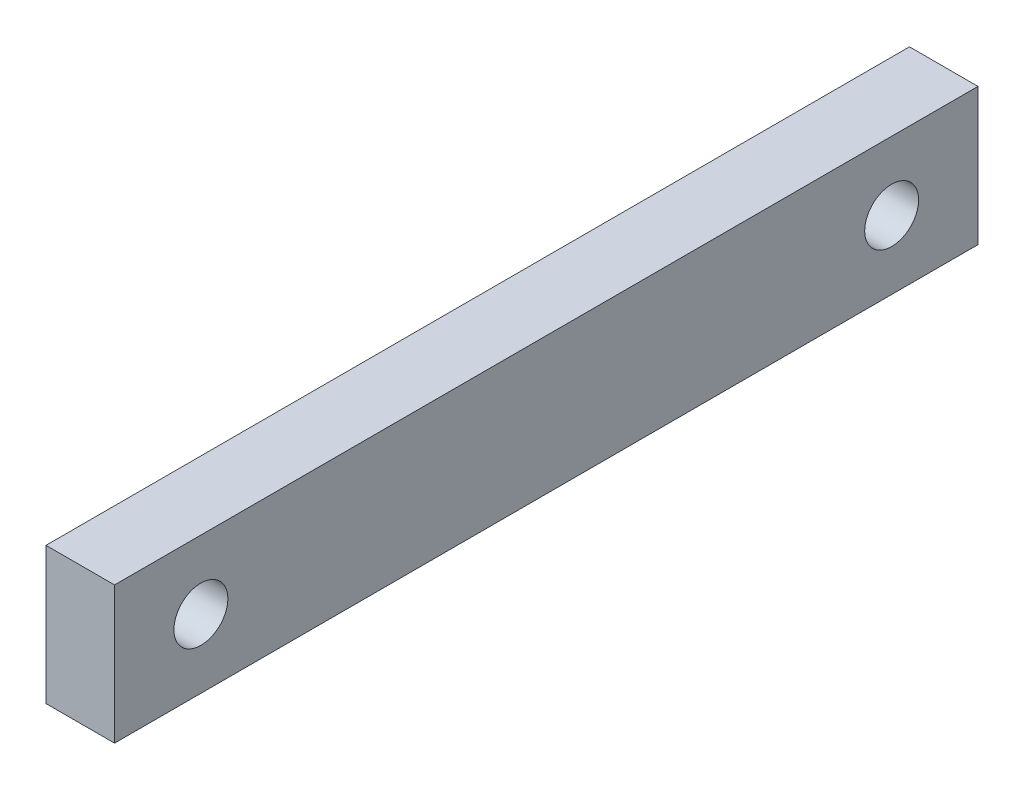
ISO-10303-21;
HEADER;
FILE_DESCRIPTION(('STEP AP214'),'2;1');
FILE_NAME('part.step','',(''),(''),'','','');
FILE_SCHEMA(('AUTOMOTIVE_DESIGN { 1 0 10303 214 1 1 1 1 }'));
ENDSEC;
DATA;
#1=APPLICATION_CONTEXT('core data for automotive mechanical design processes');
#2=APPLICATION_PROTOCOL_DEFINITION('international standard','automotive_design',2000,#1);
#3=PRODUCT_CONTEXT('',#1,'mechanical');
#4=PRODUCT('Part','Part','',(#3));
#5=PRODUCT_RELATED_PRODUCT_CATEGORY('part','',(#4));
#6=PRODUCT_DEFINITION_FORMATION('','',#4);
#7=PRODUCT_DEFINITION_CONTEXT('part definition',#1,'design');
#8=PRODUCT_DEFINITION('design','',#6,#7);
#9=PRODUCT_DEFINITION_SHAPE('','',#8);
#10=(LENGTH_UNIT() NAMED_UNIT(*) SI_UNIT(.MILLI.,.METRE.));
#11=(NAMED_UNIT(*) PLANE_ANGLE_UNIT() SI_UNIT($,.RADIAN.));
#12=(NAMED_UNIT(*) SI_UNIT($,.STERADIAN.) SOLID_ANGLE_UNIT());
#13=UNCERTAINTY_MEASURE_WITH_UNIT(LENGTH_MEASURE(1.E-05),#10,'distance_accuracy_value','');
#14=(GEOMETRIC_REPRESENTATION_CONTEXT(3) GLOBAL_UNCERTAINTY_ASSIGNED_CONTEXT((#13)) GLOBAL_UNIT_ASSIGNED_CONTEXT((#10,
#11,#12)) REPRESENTATION_CONTEXT('',''));
#15=CARTESIAN_POINT('',(0.,0.,0.));
#16=DIRECTION('',(0.,0.,1.));
#17=DIRECTION('',(1.,0.,0.));
#18=AXIS2_PLACEMENT_3D('',#15,#16,#17);
#19=CARTESIAN_POINT('',(3.175,-6.35,-40.));
#20=DIRECTION('',(1.,0.,0.));
#21=DIRECTION('',(0.,0.,-1.));
#22=AXIS2_PLACEMENT_3D('',#19,#20,#21);
#23=PLANE('',#22);
#24=CARTESIAN_POINT('',(3.175,0.,32.));
#25=DIRECTION('',(1.,0.,0.));
#26=DIRECTION('',(0.,0.,-1.));
#27=AXIS2_PLACEMENT_3D('',#24,#25,#26);
#28=CIRCLE('',#27,2.49999999999999);
#29=CARTESIAN_POINT('',(3.175,0.,29.5));
#30=VERTEX_POINT('',#29);
#31=EDGE_CURVE('E105',#30,#30,#28,.T.);
#32=ORIENTED_EDGE('',*,*,#31,.F.);
#33=EDGE_LOOP('',(#32));
#34=FACE_BOUND('',#33,.T.);
#35=CARTESIAN_POINT('',(3.175,0.,-32.));
#36=DIRECTION('',(1.,0.,0.));
#37=DIRECTION('',(0.,0.,1.));
#38=AXIS2_PLACEMENT_3D('',#35,#36,#37);
#39=CIRCLE('',#38,2.49999999999999);
#40=CARTESIAN_POINT('',(3.175,0.,-29.5));
#41=VERTEX_POINT('',#40);
#42=EDGE_CURVE('E108',#41,#41,#39,.T.);
#43=ORIENTED_EDGE('',*,*,#42,.F.);
#44=EDGE_LOOP('',(#43));
#45=FACE_BOUND('',#44,.T.);
#46=DIRECTION('',(0.,0.,1.));
#47=VECTOR('',#46,1.);
#48=CARTESIAN_POINT('',(3.175,6.35,-40.));
#49=LINE('',#48,#47);
#50=CARTESIAN_POINT('',(3.175,6.35,-40.));
#51=VERTEX_POINT('',#50);
#52=CARTESIAN_POINT('',(3.175,6.35,40.));
#53=VERTEX_POINT('',#52);
#54=EDGE_CURVE('E42',#51,#53,#49,.T.);
#55=ORIENTED_EDGE('',*,*,#54,.T.);
#56=DIRECTION('',(0.,1.,0.));
#57=VECTOR('',#56,1.);
#58=CARTESIAN_POINT('',(3.175,-6.35,40.));
#59=LINE('',#58,#57);
#60=CARTESIAN_POINT('',(3.175,-6.35,40.));
#61=VERTEX_POINT('',#60);
#62=EDGE_CURVE('E80',#61,#53,#59,.T.);
#63=ORIENTED_EDGE('',*,*,#62,.F.);
#64=DIRECTION('',(0.,0.,1.));
#65=VECTOR('',#64,1.);
#66=CARTESIAN_POINT('',(3.175,-6.35,-40.));
#67=LINE('',#66,#65);
#68=CARTESIAN_POINT('',(3.175,-6.35,-40.));
#69=VERTEX_POINT('',#68);
#70=EDGE_CURVE('E11',#69,#61,#67,.T.);
#71=ORIENTED_EDGE('',*,*,#70,.F.);
#72=DIRECTION('',(0.,1.,0.));
#73=VECTOR('',#72,1.);
#74=CARTESIAN_POINT('',(3.175,-6.35,-40.));
#75=LINE('',#74,#73);
#76=EDGE_CURVE('E81',#69,#51,#75,.T.);
#77=ORIENTED_EDGE('',*,*,#76,.T.);
#78=EDGE_LOOP('',(#55,#63,#71,#77));
#79=FACE_BOUND('',#78,.T.);
#80=ADVANCED_FACE('F39',(#34,#45,#79),#23,.T.);
#81=CARTESIAN_POINT('',(-3.175,-6.35,-40.));
#82=DIRECTION('',(0.,-1.,0.));
#83=DIRECTION('',(0.,0.,-1.));
#84=AXIS2_PLACEMENT_3D('',#81,#82,#83);
#85=PLANE('',#84);
#86=ORIENTED_EDGE('',*,*,#70,.T.);
#87=DIRECTION('',(1.,0.,0.));
#88=VECTOR('',#87,1.);
#89=CARTESIAN_POINT('',(-3.175,-6.35,40.));
#90=LINE('',#89,#88);
#91=CARTESIAN_POINT('',(-3.175,-6.35,40.));
#92=VERTEX_POINT('',#91);
#93=EDGE_CURVE('E99',#92,#61,#90,.T.);
#94=ORIENTED_EDGE('',*,*,#93,.F.);
#95=DIRECTION('',(0.,0.,1.));
#96=VECTOR('',#95,1.);
#97=CARTESIAN_POINT('',(-3.175,-6.35,-40.));
#98=LINE('',#97,#96);
#99=CARTESIAN_POINT('',(-3.175,-6.35,-40.));
#100=VERTEX_POINT('',#99);
#101=EDGE_CURVE('E48',#100,#92,#98,.T.);
#102=ORIENTED_EDGE('',*,*,#101,.F.);
#103=DIRECTION('',(1.,0.,0.));
#104=VECTOR('',#103,1.);
#105=CARTESIAN_POINT('',(-3.175,-6.35,-40.));
#106=LINE('',#105,#104);
#107=EDGE_CURVE('E87',#100,#69,#106,.T.);
#108=ORIENTED_EDGE('',*,*,#107,.T.);
#109=EDGE_LOOP('',(#86,#94,#102,#108));
#110=FACE_BOUND('',#109,.T.);
#111=ADVANCED_FACE('F131',(#110),#85,.T.);
#112=CARTESIAN_POINT('',(-3.175,-6.35,-40.));
#113=DIRECTION('',(-1.,0.,0.));
#114=DIRECTION('',(0.,0.,1.));
#115=AXIS2_PLACEMENT_3D('',#112,#113,#114);
#116=PLANE('',#115);
#117=CARTESIAN_POINT('',(-3.175,0.,32.));
#118=DIRECTION('',(1.,0.,0.));
#119=DIRECTION('',(0.,0.,-1.));
#120=AXIS2_PLACEMENT_3D('',#117,#118,#119);
#121=CIRCLE('',#120,2.49999999999999);
#122=CARTESIAN_POINT('',(-3.175,0.,29.5));
#123=VERTEX_POINT('',#122);
#124=EDGE_CURVE('E101',#123,#123,#121,.T.);
#125=ORIENTED_EDGE('',*,*,#124,.T.);
#126=EDGE_LOOP('',(#125));
#127=FACE_BOUND('',#126,.T.);
#128=CARTESIAN_POINT('',(-3.175,0.,-32.));
#129=DIRECTION('',(1.,0.,0.));
#130=DIRECTION('',(0.,0.,1.));
#131=AXIS2_PLACEMENT_3D('',#128,#129,#130);
#132=CIRCLE('',#131,2.49999999999999);
#133=CARTESIAN_POINT('',(-3.175,0.,-29.5));
#134=VERTEX_POINT('',#133);
#135=EDGE_CURVE('E155',#134,#134,#132,.T.);
#136=ORIENTED_EDGE('',*,*,#135,.T.);
#137=EDGE_LOOP('',(#136));
#138=FACE_BOUND('',#137,.T.);
#139=ORIENTED_EDGE('',*,*,#101,.T.);
#140=DIRECTION('',(0.,-1.,0.));
#141=VECTOR('',#140,1.);
#142=CARTESIAN_POINT('',(-3.175,-6.35,40.));
#143=LINE('',#142,#141);
#144=CARTESIAN_POINT('',(-3.175,6.35,40.));
#145=VERTEX_POINT('',#144);
#146=EDGE_CURVE('E95',#145,#92,#143,.T.);
#147=ORIENTED_EDGE('',*,*,#146,.F.);
#148=DIRECTION('',(0.,0.,1.));
#149=VECTOR('',#148,1.);
#150=CARTESIAN_POINT('',(-3.175,6.35,-40.));
#151=LINE('',#150,#149);
#152=CARTESIAN_POINT('',(-3.175,6.35,-40.));
#153=VERTEX_POINT('',#152);
#154=EDGE_CURVE('E86',#153,#145,#151,.T.);
#155=ORIENTED_EDGE('',*,*,#154,.F.);
#156=DIRECTION('',(0.,-1.,0.));
#157=VECTOR('',#156,1.);
#158=CARTESIAN_POINT('',(-3.175,-6.35,-40.));
#159=LINE('',#158,#157);
#160=EDGE_CURVE('E120',#153,#100,#159,.T.);
#161=ORIENTED_EDGE('',*,*,#160,.T.);
#162=EDGE_LOOP('',(#139,#147,#155,#161));
#163=FACE_BOUND('',#162,.T.);
#164=ADVANCED_FACE('F128',(#127,#138,#163),#116,.T.);
#165=CARTESIAN_POINT('',(-3.175,6.35,-40.));
#166=DIRECTION('',(0.,1.,0.));
#167=DIRECTION('',(0.,0.,1.));
#168=AXIS2_PLACEMENT_3D('',#165,#166,#167);
#169=PLANE('',#168);
#170=ORIENTED_EDGE('',*,*,#154,.T.);
#171=DIRECTION('',(-1.,0.,0.));
#172=VECTOR('',#171,1.);
#173=CARTESIAN_POINT('',(-3.175,6.35,40.));
#174=LINE('',#173,#172);
#175=EDGE_CURVE('E89',#53,#145,#174,.T.);
#176=ORIENTED_EDGE('',*,*,#175,.F.);
#177=ORIENTED_EDGE('',*,*,#54,.F.);
#178=DIRECTION('',(-1.,0.,0.));
#179=VECTOR('',#178,1.);
#180=CARTESIAN_POINT('',(-3.175,6.35,-40.));
#181=LINE('',#180,#179);
#182=EDGE_CURVE('E117',#51,#153,#181,.T.);
#183=ORIENTED_EDGE('',*,*,#182,.T.);
#184=EDGE_LOOP('',(#170,#176,#177,#183));
#185=FACE_BOUND('',#184,.T.);
#186=ADVANCED_FACE('F90',(#185),#169,.T.);
#187=CARTESIAN_POINT('',(0.,0.,-40.));
#188=DIRECTION('',(0.,0.,-1.));
#189=DIRECTION('',(-1.,0.,0.));
#190=AXIS2_PLACEMENT_3D('',#187,#188,#189);
#191=PLANE('',#190);
#192=ORIENTED_EDGE('',*,*,#76,.F.);
#193=ORIENTED_EDGE('',*,*,#107,.F.);
#194=ORIENTED_EDGE('',*,*,#160,.F.);
#195=ORIENTED_EDGE('',*,*,#182,.F.);
#196=EDGE_LOOP('',(#192,#193,#194,#195));
#197=FACE_BOUND('',#196,.T.);
#198=ADVANCED_FACE('F133',(#197),#191,.T.);
#199=CARTESIAN_POINT('',(0.,0.,40.));
#200=DIRECTION('',(0.,0.,-1.));
#201=DIRECTION('',(-1.,0.,0.));
#202=AXIS2_PLACEMENT_3D('',#199,#200,#201);
#203=PLANE('',#202);
#204=ORIENTED_EDGE('',*,*,#62,.T.);
#205=ORIENTED_EDGE('',*,*,#175,.T.);
#206=ORIENTED_EDGE('',*,*,#146,.T.);
#207=ORIENTED_EDGE('',*,*,#93,.T.);
#208=EDGE_LOOP('',(#204,#205,#206,#207));
#209=FACE_BOUND('',#208,.T.);
#210=ADVANCED_FACE('F98',(#209),#203,.F.);
#211=CARTESIAN_POINT('',(-3.175,0.,-32.));
#212=DIRECTION('',(1.,0.,0.));
#213=DIRECTION('',(0.,0.,-1.));
#214=AXIS2_PLACEMENT_3D('',#211,#212,#213);
#215=CYLINDRICAL_SURFACE('',#214,2.49999999999999);
#216=ORIENTED_EDGE('',*,*,#135,.F.);
#217=EDGE_LOOP('',(#216));
#218=FACE_BOUND('',#217,.T.);
#219=ORIENTED_EDGE('',*,*,#42,.T.);
#220=EDGE_LOOP('',(#219));
#221=FACE_BOUND('',#220,.T.);
#222=ADVANCED_FACE('F140',(#218,#221),#215,.F.);
#223=CARTESIAN_POINT('',(-3.175,0.,32.));
#224=DIRECTION('',(1.,0.,0.));
#225=DIRECTION('',(0.,0.,-1.));
#226=AXIS2_PLACEMENT_3D('',#223,#224,#225);
#227=CYLINDRICAL_SURFACE('',#226,2.49999999999999);
#228=ORIENTED_EDGE('',*,*,#124,.F.);
#229=EDGE_LOOP('',(#228));
#230=FACE_BOUND('',#229,.T.);
#231=ORIENTED_EDGE('',*,*,#31,.T.);
#232=EDGE_LOOP('',(#231));
#233=FACE_BOUND('',#232,.T.);
#234=ADVANCED_FACE('F163',(#230,#233),#227,.F.);
#235=CLOSED_SHELL('',(#80,#111,#164,#186,#198,#210,#222,#234));
#236=MANIFOLD_SOLID_BREP('B2',#235);
#237=ADVANCED_BREP_SHAPE_REPRESENTATION('',(#18,#236),#14);
#238=SHAPE_DEFINITION_REPRESENTATION(#9,#237);
ENDSEC;
END-ISO-10303-21;
